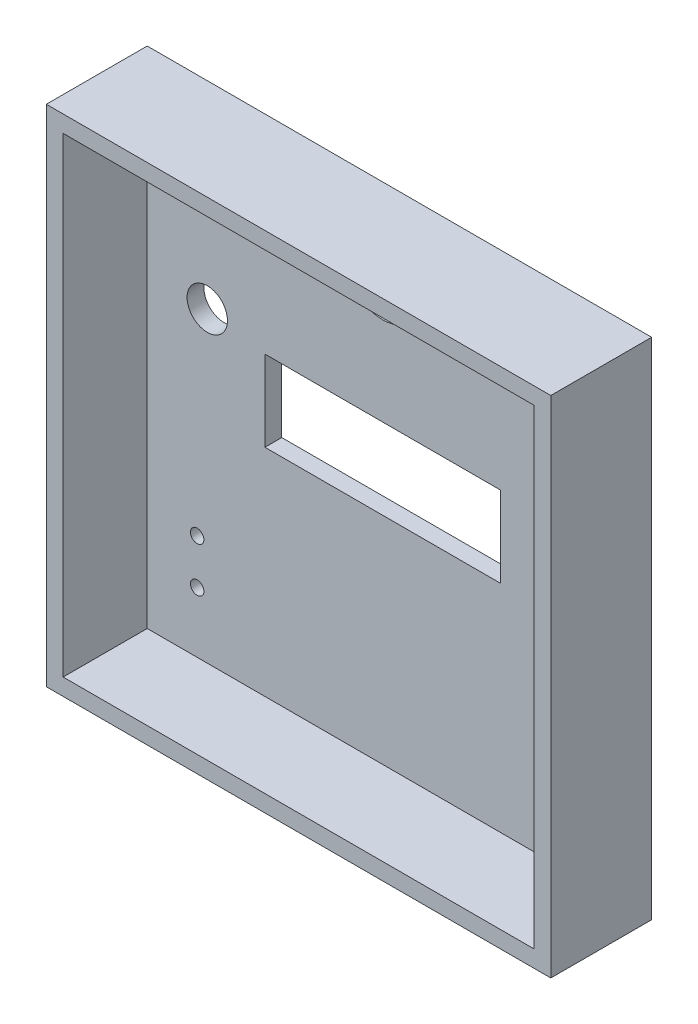
ISO-10303-21;
HEADER;
FILE_DESCRIPTION(('STEP AP214'),'2;1');
FILE_NAME('part.step','',(''),(''),'','','');
FILE_SCHEMA(('AUTOMOTIVE_DESIGN { 1 0 10303 214 1 1 1 1 }'));
ENDSEC;
DATA;
#1=APPLICATION_CONTEXT('core data for automotive mechanical design processes');
#2=APPLICATION_PROTOCOL_DEFINITION('international standard','automotive_design',2000,#1);
#3=PRODUCT_CONTEXT('',#1,'mechanical');
#4=PRODUCT('Part','Part','',(#3));
#5=PRODUCT_RELATED_PRODUCT_CATEGORY('part','',(#4));
#6=PRODUCT_DEFINITION_FORMATION('','',#4);
#7=PRODUCT_DEFINITION_CONTEXT('part definition',#1,'design');
#8=PRODUCT_DEFINITION('design','',#6,#7);
#9=PRODUCT_DEFINITION_SHAPE('','',#8);
#10=(LENGTH_UNIT() NAMED_UNIT(*) SI_UNIT(.MILLI.,.METRE.));
#11=(NAMED_UNIT(*) PLANE_ANGLE_UNIT() SI_UNIT($,.RADIAN.));
#12=(NAMED_UNIT(*) SI_UNIT($,.STERADIAN.) SOLID_ANGLE_UNIT());
#13=UNCERTAINTY_MEASURE_WITH_UNIT(LENGTH_MEASURE(1.E-05),#10,'distance_accuracy_value','');
#14=(GEOMETRIC_REPRESENTATION_CONTEXT(3) GLOBAL_UNCERTAINTY_ASSIGNED_CONTEXT((#13)) GLOBAL_UNIT_ASSIGNED_CONTEXT((#10,
#11,#12)) REPRESENTATION_CONTEXT('',''));
#15=CARTESIAN_POINT('',(0.,0.,0.));
#16=DIRECTION('',(0.,0.,1.));
#17=DIRECTION('',(1.,0.,0.));
#18=AXIS2_PLACEMENT_3D('',#15,#16,#17);
#19=CARTESIAN_POINT('',(75.,75.,30.));
#20=DIRECTION('',(-1.,0.,0.));
#21=DIRECTION('',(0.,0.,1.));
#22=AXIS2_PLACEMENT_3D('',#19,#20,#21);
#23=PLANE('',#22);
#24=DIRECTION('',(0.,1.,0.));
#25=VECTOR('',#24,1.);
#26=CARTESIAN_POINT('',(75.,75.,0.));
#27=LINE('',#26,#25);
#28=CARTESIAN_POINT('',(75.,-75.,0.));
#29=VERTEX_POINT('',#28);
#30=CARTESIAN_POINT('',(75.,75.,0.));
#31=VERTEX_POINT('',#30);
#32=EDGE_CURVE('E161',#29,#31,#27,.T.);
#33=ORIENTED_EDGE('',*,*,#32,.T.);
#34=DIRECTION('',(0.,0.,-1.));
#35=VECTOR('',#34,1.);
#36=CARTESIAN_POINT('',(75.,75.,30.));
#37=LINE('',#36,#35);
#38=CARTESIAN_POINT('',(75.,75.,30.));
#39=VERTEX_POINT('',#38);
#40=EDGE_CURVE('E211',#39,#31,#37,.T.);
#41=ORIENTED_EDGE('',*,*,#40,.F.);
#42=DIRECTION('',(0.,1.,0.));
#43=VECTOR('',#42,1.);
#44=CARTESIAN_POINT('',(75.,75.,30.));
#45=LINE('',#44,#43);
#46=CARTESIAN_POINT('',(75.,-75.,30.));
#47=VERTEX_POINT('',#46);
#48=EDGE_CURVE('E185',#47,#39,#45,.T.);
#49=ORIENTED_EDGE('',*,*,#48,.F.);
#50=DIRECTION('',(0.,0.,-1.));
#51=VECTOR('',#50,1.);
#52=CARTESIAN_POINT('',(75.,-75.,30.));
#53=LINE('',#52,#51);
#54=EDGE_CURVE('E195',#47,#29,#53,.T.);
#55=ORIENTED_EDGE('',*,*,#54,.T.);
#56=EDGE_LOOP('',(#33,#41,#49,#55));
#57=FACE_BOUND('',#56,.T.);
#58=ADVANCED_FACE('F33',(#57),#23,.F.);
#59=CARTESIAN_POINT('',(-75.,75.,30.));
#60=DIRECTION('',(0.,-1.,0.));
#61=DIRECTION('',(0.,0.,-1.));
#62=AXIS2_PLACEMENT_3D('',#59,#60,#61);
#63=PLANE('',#62);
#64=DIRECTION('',(-1.,0.,0.));
#65=VECTOR('',#64,1.);
#66=CARTESIAN_POINT('',(-75.,75.,0.));
#67=LINE('',#66,#65);
#68=CARTESIAN_POINT('',(-75.,75.,0.));
#69=VERTEX_POINT('',#68);
#70=EDGE_CURVE('E198',#31,#69,#67,.T.);
#71=ORIENTED_EDGE('',*,*,#70,.T.);
#72=DIRECTION('',(0.,0.,-1.));
#73=VECTOR('',#72,1.);
#74=CARTESIAN_POINT('',(-75.,75.,30.));
#75=LINE('',#74,#73);
#76=CARTESIAN_POINT('',(-75.,75.,30.));
#77=VERTEX_POINT('',#76);
#78=EDGE_CURVE('E208',#77,#69,#75,.T.);
#79=ORIENTED_EDGE('',*,*,#78,.F.);
#80=DIRECTION('',(-1.,0.,0.));
#81=VECTOR('',#80,1.);
#82=CARTESIAN_POINT('',(-75.,75.,30.));
#83=LINE('',#82,#81);
#84=EDGE_CURVE('E188',#39,#77,#83,.T.);
#85=ORIENTED_EDGE('',*,*,#84,.F.);
#86=ORIENTED_EDGE('',*,*,#40,.T.);
#87=EDGE_LOOP('',(#71,#79,#85,#86));
#88=FACE_BOUND('',#87,.T.);
#89=ADVANCED_FACE('F268',(#88),#63,.F.);
#90=CARTESIAN_POINT('',(-75.,75.,30.));
#91=DIRECTION('',(1.,0.,0.));
#92=DIRECTION('',(0.,1.,0.));
#93=AXIS2_PLACEMENT_3D('',#90,#91,#92);
#94=PLANE('',#93);
#95=DIRECTION('',(0.,-1.,0.));
#96=VECTOR('',#95,1.);
#97=CARTESIAN_POINT('',(-75.,75.,0.));
#98=LINE('',#97,#96);
#99=CARTESIAN_POINT('',(-75.,-75.,0.));
#100=VERTEX_POINT('',#99);
#101=EDGE_CURVE('E200',#69,#100,#98,.T.);
#102=ORIENTED_EDGE('',*,*,#101,.T.);
#103=DIRECTION('',(0.,0.,-1.));
#104=VECTOR('',#103,1.);
#105=CARTESIAN_POINT('',(-75.,-75.,30.));
#106=LINE('',#105,#104);
#107=CARTESIAN_POINT('',(-75.,-75.,30.));
#108=VERTEX_POINT('',#107);
#109=EDGE_CURVE('E205',#108,#100,#106,.T.);
#110=ORIENTED_EDGE('',*,*,#109,.F.);
#111=DIRECTION('',(0.,-1.,0.));
#112=VECTOR('',#111,1.);
#113=CARTESIAN_POINT('',(-75.,75.,30.));
#114=LINE('',#113,#112);
#115=EDGE_CURVE('E191',#77,#108,#114,.T.);
#116=ORIENTED_EDGE('',*,*,#115,.F.);
#117=ORIENTED_EDGE('',*,*,#78,.T.);
#118=EDGE_LOOP('',(#102,#110,#116,#117));
#119=FACE_BOUND('',#118,.T.);
#120=ADVANCED_FACE('F273',(#119),#94,.F.);
#121=CARTESIAN_POINT('',(-75.,-75.,30.));
#122=DIRECTION('',(0.,1.,0.));
#123=DIRECTION('',(0.,0.,1.));
#124=AXIS2_PLACEMENT_3D('',#121,#122,#123);
#125=PLANE('',#124);
#126=DIRECTION('',(1.,0.,0.));
#127=VECTOR('',#126,1.);
#128=CARTESIAN_POINT('',(-75.,-75.,0.));
#129=LINE('',#128,#127);
#130=EDGE_CURVE('E189',#100,#29,#129,.T.);
#131=ORIENTED_EDGE('',*,*,#130,.T.);
#132=ORIENTED_EDGE('',*,*,#54,.F.);
#133=DIRECTION('',(1.,0.,0.));
#134=VECTOR('',#133,1.);
#135=CARTESIAN_POINT('',(-75.,-75.,30.));
#136=LINE('',#135,#134);
#137=EDGE_CURVE('E193',#108,#47,#136,.T.);
#138=ORIENTED_EDGE('',*,*,#137,.F.);
#139=ORIENTED_EDGE('',*,*,#109,.T.);
#140=EDGE_LOOP('',(#131,#132,#138,#139));
#141=FACE_BOUND('',#140,.T.);
#142=ADVANCED_FACE('F261',(#141),#125,.F.);
#143=CARTESIAN_POINT('',(75.,-75.,30.));
#144=DIRECTION('',(0.,0.,1.));
#145=DIRECTION('',(1.,0.,0.));
#146=AXIS2_PLACEMENT_3D('',#143,#144,#145);
#147=PLANE('',#146);
#148=DIRECTION('',(0.,1.,0.));
#149=VECTOR('',#148,1.);
#150=CARTESIAN_POINT('',(70.,75.,30.));
#151=LINE('',#150,#149);
#152=CARTESIAN_POINT('',(70.,-70.,30.));
#153=VERTEX_POINT('',#152);
#154=CARTESIAN_POINT('',(70.,70.,30.));
#155=VERTEX_POINT('',#154);
#156=EDGE_CURVE('E177',#153,#155,#151,.T.);
#157=ORIENTED_EDGE('',*,*,#156,.F.);
#158=DIRECTION('',(1.,0.,0.));
#159=VECTOR('',#158,1.);
#160=CARTESIAN_POINT('',(-75.,-70.,30.));
#161=LINE('',#160,#159);
#162=CARTESIAN_POINT('',(-70.,-70.,30.));
#163=VERTEX_POINT('',#162);
#164=EDGE_CURVE('E167',#163,#153,#161,.T.);
#165=ORIENTED_EDGE('',*,*,#164,.F.);
#166=DIRECTION('',(0.,-1.,0.));
#167=VECTOR('',#166,1.);
#168=CARTESIAN_POINT('',(-70.,75.,30.));
#169=LINE('',#168,#167);
#170=CARTESIAN_POINT('',(-70.,70.,30.));
#171=VERTEX_POINT('',#170);
#172=EDGE_CURVE('E181',#171,#163,#169,.T.);
#173=ORIENTED_EDGE('',*,*,#172,.F.);
#174=DIRECTION('',(-1.,0.,0.));
#175=VECTOR('',#174,1.);
#176=CARTESIAN_POINT('',(-75.,70.,30.));
#177=LINE('',#176,#175);
#178=EDGE_CURVE('E179',#155,#171,#177,.T.);
#179=ORIENTED_EDGE('',*,*,#178,.F.);
#180=EDGE_LOOP('',(#157,#165,#173,#179));
#181=FACE_BOUND('',#180,.T.);
#182=ORIENTED_EDGE('',*,*,#48,.T.);
#183=ORIENTED_EDGE('',*,*,#84,.T.);
#184=ORIENTED_EDGE('',*,*,#115,.T.);
#185=ORIENTED_EDGE('',*,*,#137,.T.);
#186=EDGE_LOOP('',(#182,#183,#184,#185));
#187=FACE_BOUND('',#186,.T.);
#188=ADVANCED_FACE('F249',(#181,#187),#147,.T.);
#189=CARTESIAN_POINT('',(75.,-75.,0.));
#190=DIRECTION('',(0.,0.,1.));
#191=DIRECTION('',(1.,0.,0.));
#192=AXIS2_PLACEMENT_3D('',#189,#190,#191);
#193=PLANE('',#192);
#194=CARTESIAN_POINT('',(-55.1472827008486,-38.7311792236434,0.));
#195=DIRECTION('',(0.,0.,-1.));
#196=DIRECTION('',(-1.,0.,0.));
#197=AXIS2_PLACEMENT_3D('',#194,#195,#196);
#198=CIRCLE('',#197,2.);
#199=CARTESIAN_POINT('',(-57.1472827008486,-38.7311792236434,0.));
#200=VERTEX_POINT('',#199);
#201=EDGE_CURVE('E239',#200,#200,#198,.T.);
#202=ORIENTED_EDGE('',*,*,#201,.F.);
#203=EDGE_LOOP('',(#202));
#204=FACE_BOUND('',#203,.T.);
#205=CARTESIAN_POINT('',(-55.1472827008486,-52.0314296765937,0.));
#206=DIRECTION('',(0.,0.,-1.));
#207=DIRECTION('',(-1.,0.,0.));
#208=AXIS2_PLACEMENT_3D('',#205,#206,#207);
#209=CIRCLE('',#208,2.);
#210=CARTESIAN_POINT('',(-57.1472827008486,-52.0314296765937,0.));
#211=VERTEX_POINT('',#210);
#212=EDGE_CURVE('E229',#211,#211,#209,.T.);
#213=ORIENTED_EDGE('',*,*,#212,.F.);
#214=EDGE_LOOP('',(#213));
#215=FACE_BOUND('',#214,.T.);
#216=CARTESIAN_POINT('',(48.9524529872266,-41.3905070812934,0.));
#217=DIRECTION('',(0.,0.,-1.));
#218=DIRECTION('',(-1.,0.,0.));
#219=AXIS2_PLACEMENT_3D('',#216,#217,#218);
#220=CIRCLE('',#219,2.5);
#221=CARTESIAN_POINT('',(46.4524529872266,-41.3905070812934,0.));
#222=VERTEX_POINT('',#221);
#223=EDGE_CURVE('E226',#222,#222,#220,.T.);
#224=ORIENTED_EDGE('',*,*,#223,.F.);
#225=EDGE_LOOP('',(#224));
#226=FACE_BOUND('',#225,.T.);
#227=CARTESIAN_POINT('',(-52.1423607750195,21.1958602825252,0.));
#228=DIRECTION('',(0.,0.,-1.));
#229=DIRECTION('',(-1.,0.,0.));
#230=AXIS2_PLACEMENT_3D('',#227,#228,#229);
#231=CIRCLE('',#230,6.);
#232=CARTESIAN_POINT('',(-58.1423607750195,21.1958602825252,0.));
#233=VERTEX_POINT('',#232);
#234=EDGE_CURVE('E223',#233,#233,#231,.T.);
#235=ORIENTED_EDGE('',*,*,#234,.F.);
#236=EDGE_LOOP('',(#235));
#237=FACE_BOUND('',#236,.T.);
#238=DIRECTION('',(1.,0.,0.));
#239=VECTOR('',#238,1.);
#240=CARTESIAN_POINT('',(35.,18.168751782236,0.));
#241=LINE('',#240,#239);
#242=CARTESIAN_POINT('',(-35.,18.168751782236,0.));
#243=VERTEX_POINT('',#242);
#244=CARTESIAN_POINT('',(35.,18.168751782236,0.));
#245=VERTEX_POINT('',#244);
#246=EDGE_CURVE('E134',#243,#245,#241,.T.);
#247=ORIENTED_EDGE('',*,*,#246,.F.);
#248=DIRECTION('',(0.,1.,0.));
#249=VECTOR('',#248,1.);
#250=CARTESIAN_POINT('',(-35.,18.168751782236,0.));
#251=LINE('',#250,#249);
#252=CARTESIAN_POINT('',(-35.,-5.83124821776399,0.));
#253=VERTEX_POINT('',#252);
#254=EDGE_CURVE('E49',#253,#243,#251,.T.);
#255=ORIENTED_EDGE('',*,*,#254,.F.);
#256=DIRECTION('',(-1.,0.,0.));
#257=VECTOR('',#256,1.);
#258=CARTESIAN_POINT('',(35.,-5.83124821776399,0.));
#259=LINE('',#258,#257);
#260=CARTESIAN_POINT('',(35.,-5.83124821776399,0.));
#261=VERTEX_POINT('',#260);
#262=EDGE_CURVE('E141',#261,#253,#259,.T.);
#263=ORIENTED_EDGE('',*,*,#262,.F.);
#264=DIRECTION('',(0.,-1.,0.));
#265=VECTOR('',#264,1.);
#266=CARTESIAN_POINT('',(35.,18.168751782236,0.));
#267=LINE('',#266,#265);
#268=EDGE_CURVE('E125',#245,#261,#267,.T.);
#269=ORIENTED_EDGE('',*,*,#268,.F.);
#270=EDGE_LOOP('',(#247,#255,#263,#269));
#271=FACE_BOUND('',#270,.T.);
#272=CARTESIAN_POINT('',(0.,55.5037568031629,0.));
#273=DIRECTION('',(0.,0.,-1.));
#274=DIRECTION('',(-1.,0.,0.));
#275=AXIS2_PLACEMENT_3D('',#272,#273,#274);
#276=CIRCLE('',#275,11.);
#277=CARTESIAN_POINT('',(-11.,55.5037568031629,0.));
#278=VERTEX_POINT('',#277);
#279=EDGE_CURVE('E148',#278,#278,#276,.T.);
#280=ORIENTED_EDGE('',*,*,#279,.F.);
#281=EDGE_LOOP('',(#280));
#282=FACE_BOUND('',#281,.T.);
#283=ORIENTED_EDGE('',*,*,#32,.F.);
#284=ORIENTED_EDGE('',*,*,#130,.F.);
#285=ORIENTED_EDGE('',*,*,#101,.F.);
#286=ORIENTED_EDGE('',*,*,#70,.F.);
#287=EDGE_LOOP('',(#283,#284,#285,#286));
#288=FACE_BOUND('',#287,.T.);
#289=ADVANCED_FACE('F138',(#204,#215,#226,#237,#271,#282,#288),#193,.F.);
#290=CARTESIAN_POINT('',(70.,75.,30.));
#291=DIRECTION('',(-1.,0.,0.));
#292=DIRECTION('',(0.,0.,1.));
#293=AXIS2_PLACEMENT_3D('',#290,#291,#292);
#294=PLANE('',#293);
#295=DIRECTION('',(0.,1.,0.));
#296=VECTOR('',#295,1.);
#297=CARTESIAN_POINT('',(70.,75.,5.));
#298=LINE('',#297,#296);
#299=CARTESIAN_POINT('',(70.,-70.,5.));
#300=VERTEX_POINT('',#299);
#301=CARTESIAN_POINT('',(70.,70.,5.));
#302=VERTEX_POINT('',#301);
#303=EDGE_CURVE('E154',#300,#302,#298,.T.);
#304=ORIENTED_EDGE('',*,*,#303,.F.);
#305=DIRECTION('',(0.,0.,-1.));
#306=VECTOR('',#305,1.);
#307=CARTESIAN_POINT('',(70.,-70.,30.));
#308=LINE('',#307,#306);
#309=EDGE_CURVE('E163',#153,#300,#308,.T.);
#310=ORIENTED_EDGE('',*,*,#309,.F.);
#311=ORIENTED_EDGE('',*,*,#156,.T.);
#312=DIRECTION('',(0.,0.,-1.));
#313=VECTOR('',#312,1.);
#314=CARTESIAN_POINT('',(70.,70.,30.));
#315=LINE('',#314,#313);
#316=EDGE_CURVE('E158',#155,#302,#315,.T.);
#317=ORIENTED_EDGE('',*,*,#316,.T.);
#318=EDGE_LOOP('',(#304,#310,#311,#317));
#319=FACE_BOUND('',#318,.T.);
#320=ADVANCED_FACE('F248',(#319),#294,.T.);
#321=CARTESIAN_POINT('',(-75.,70.,30.));
#322=DIRECTION('',(0.,-1.,0.));
#323=DIRECTION('',(0.,0.,-1.));
#324=AXIS2_PLACEMENT_3D('',#321,#322,#323);
#325=PLANE('',#324);
#326=DIRECTION('',(-1.,0.,0.));
#327=VECTOR('',#326,1.);
#328=CARTESIAN_POINT('',(-75.,70.,5.));
#329=LINE('',#328,#327);
#330=CARTESIAN_POINT('',(-70.,70.,5.));
#331=VERTEX_POINT('',#330);
#332=EDGE_CURVE('E157',#302,#331,#329,.T.);
#333=ORIENTED_EDGE('',*,*,#332,.F.);
#334=ORIENTED_EDGE('',*,*,#316,.F.);
#335=ORIENTED_EDGE('',*,*,#178,.T.);
#336=DIRECTION('',(0.,0.,-1.));
#337=VECTOR('',#336,1.);
#338=CARTESIAN_POINT('',(-70.,70.,30.));
#339=LINE('',#338,#337);
#340=EDGE_CURVE('E162',#171,#331,#339,.T.);
#341=ORIENTED_EDGE('',*,*,#340,.T.);
#342=EDGE_LOOP('',(#333,#334,#335,#341));
#343=FACE_BOUND('',#342,.T.);
#344=ADVANCED_FACE('F257',(#343),#325,.T.);
#345=CARTESIAN_POINT('',(-70.,75.,30.));
#346=DIRECTION('',(1.,0.,0.));
#347=DIRECTION('',(0.,1.,0.));
#348=AXIS2_PLACEMENT_3D('',#345,#346,#347);
#349=PLANE('',#348);
#350=DIRECTION('',(0.,-1.,0.));
#351=VECTOR('',#350,1.);
#352=CARTESIAN_POINT('',(-70.,75.,5.));
#353=LINE('',#352,#351);
#354=CARTESIAN_POINT('',(-70.,-70.,5.));
#355=VERTEX_POINT('',#354);
#356=EDGE_CURVE('E169',#331,#355,#353,.T.);
#357=ORIENTED_EDGE('',*,*,#356,.F.);
#358=ORIENTED_EDGE('',*,*,#340,.F.);
#359=ORIENTED_EDGE('',*,*,#172,.T.);
#360=DIRECTION('',(0.,0.,-1.));
#361=VECTOR('',#360,1.);
#362=CARTESIAN_POINT('',(-70.,-70.,30.));
#363=LINE('',#362,#361);
#364=EDGE_CURVE('E166',#163,#355,#363,.T.);
#365=ORIENTED_EDGE('',*,*,#364,.T.);
#366=EDGE_LOOP('',(#357,#358,#359,#365));
#367=FACE_BOUND('',#366,.T.);
#368=ADVANCED_FACE('F314',(#367),#349,.T.);
#369=CARTESIAN_POINT('',(-75.,-70.,30.));
#370=DIRECTION('',(0.,1.,0.));
#371=DIRECTION('',(0.,0.,1.));
#372=AXIS2_PLACEMENT_3D('',#369,#370,#371);
#373=PLANE('',#372);
#374=DIRECTION('',(1.,0.,0.));
#375=VECTOR('',#374,1.);
#376=CARTESIAN_POINT('',(-75.,-70.,5.));
#377=LINE('',#376,#375);
#378=EDGE_CURVE('E173',#355,#300,#377,.T.);
#379=ORIENTED_EDGE('',*,*,#378,.F.);
#380=ORIENTED_EDGE('',*,*,#364,.F.);
#381=ORIENTED_EDGE('',*,*,#164,.T.);
#382=ORIENTED_EDGE('',*,*,#309,.T.);
#383=EDGE_LOOP('',(#379,#380,#381,#382));
#384=FACE_BOUND('',#383,.T.);
#385=ADVANCED_FACE('F322',(#384),#373,.T.);
#386=CARTESIAN_POINT('',(75.,-75.,5.));
#387=DIRECTION('',(0.,0.,1.));
#388=DIRECTION('',(1.,0.,0.));
#389=AXIS2_PLACEMENT_3D('',#386,#387,#388);
#390=PLANE('',#389);
#391=CARTESIAN_POINT('',(-55.1472827008486,-38.7311792236434,5.));
#392=DIRECTION('',(0.,0.,1.));
#393=DIRECTION('',(1.,0.,0.));
#394=AXIS2_PLACEMENT_3D('',#391,#392,#393);
#395=CIRCLE('',#394,2.);
#396=CARTESIAN_POINT('',(-53.1472827008486,-38.7311792236434,5.));
#397=VERTEX_POINT('',#396);
#398=EDGE_CURVE('E36',#397,#397,#395,.T.);
#399=ORIENTED_EDGE('',*,*,#398,.F.);
#400=EDGE_LOOP('',(#399));
#401=FACE_BOUND('',#400,.T.);
#402=CARTESIAN_POINT('',(-55.1472827008486,-52.0314296765937,5.));
#403=DIRECTION('',(0.,0.,1.));
#404=DIRECTION('',(1.,0.,0.));
#405=AXIS2_PLACEMENT_3D('',#402,#403,#404);
#406=CIRCLE('',#405,2.);
#407=CARTESIAN_POINT('',(-53.1472827008486,-52.0314296765937,5.));
#408=VERTEX_POINT('',#407);
#409=EDGE_CURVE('E227',#408,#408,#406,.T.);
#410=ORIENTED_EDGE('',*,*,#409,.F.);
#411=EDGE_LOOP('',(#410));
#412=FACE_BOUND('',#411,.T.);
#413=CARTESIAN_POINT('',(48.9524529872266,-41.3905070812934,5.));
#414=DIRECTION('',(0.,0.,1.));
#415=DIRECTION('',(1.,0.,0.));
#416=AXIS2_PLACEMENT_3D('',#413,#414,#415);
#417=CIRCLE('',#416,2.5);
#418=CARTESIAN_POINT('',(51.4524529872266,-41.3905070812934,5.));
#419=VERTEX_POINT('',#418);
#420=EDGE_CURVE('E224',#419,#419,#417,.T.);
#421=ORIENTED_EDGE('',*,*,#420,.F.);
#422=EDGE_LOOP('',(#421));
#423=FACE_BOUND('',#422,.T.);
#424=CARTESIAN_POINT('',(-52.1423607750195,21.1958602825252,5.));
#425=DIRECTION('',(0.,0.,1.));
#426=DIRECTION('',(1.,0.,0.));
#427=AXIS2_PLACEMENT_3D('',#424,#425,#426);
#428=CIRCLE('',#427,6.);
#429=CARTESIAN_POINT('',(-46.1423607750195,21.1958602825252,5.));
#430=VERTEX_POINT('',#429);
#431=EDGE_CURVE('E220',#430,#430,#428,.T.);
#432=ORIENTED_EDGE('',*,*,#431,.F.);
#433=EDGE_LOOP('',(#432));
#434=FACE_BOUND('',#433,.T.);
#435=DIRECTION('',(0.,-1.,0.));
#436=VECTOR('',#435,1.);
#437=CARTESIAN_POINT('',(-35.,-75.,5.));
#438=LINE('',#437,#436);
#439=CARTESIAN_POINT('',(-35.,18.168751782236,5.));
#440=VERTEX_POINT('',#439);
#441=CARTESIAN_POINT('',(-35.,-5.83124821776399,5.));
#442=VERTEX_POINT('',#441);
#443=EDGE_CURVE('E11',#440,#442,#438,.T.);
#444=ORIENTED_EDGE('',*,*,#443,.F.);
#445=DIRECTION('',(-1.,0.,0.));
#446=VECTOR('',#445,1.);
#447=CARTESIAN_POINT('',(75.,18.168751782236,5.));
#448=LINE('',#447,#446);
#449=CARTESIAN_POINT('',(35.,18.168751782236,5.));
#450=VERTEX_POINT('',#449);
#451=EDGE_CURVE('E214',#450,#440,#448,.T.);
#452=ORIENTED_EDGE('',*,*,#451,.F.);
#453=DIRECTION('',(0.,1.,0.));
#454=VECTOR('',#453,1.);
#455=CARTESIAN_POINT('',(35.,-75.,5.));
#456=LINE('',#455,#454);
#457=CARTESIAN_POINT('',(35.,-5.83124821776399,5.));
#458=VERTEX_POINT('',#457);
#459=EDGE_CURVE('E128',#458,#450,#456,.T.);
#460=ORIENTED_EDGE('',*,*,#459,.F.);
#461=DIRECTION('',(1.,0.,0.));
#462=VECTOR('',#461,1.);
#463=CARTESIAN_POINT('',(75.,-5.83124821776399,5.));
#464=LINE('',#463,#462);
#465=EDGE_CURVE('E41',#442,#458,#464,.T.);
#466=ORIENTED_EDGE('',*,*,#465,.F.);
#467=EDGE_LOOP('',(#444,#452,#460,#466));
#468=FACE_BOUND('',#467,.T.);
#469=CARTESIAN_POINT('',(0.,55.5037568031629,5.));
#470=DIRECTION('',(0.,0.,1.));
#471=DIRECTION('',(1.,0.,0.));
#472=AXIS2_PLACEMENT_3D('',#469,#470,#471);
#473=CIRCLE('',#472,11.);
#474=CARTESIAN_POINT('',(11.,55.5037568031629,5.));
#475=VERTEX_POINT('',#474);
#476=EDGE_CURVE('E153',#475,#475,#473,.T.);
#477=ORIENTED_EDGE('',*,*,#476,.F.);
#478=EDGE_LOOP('',(#477));
#479=FACE_BOUND('',#478,.T.);
#480=ORIENTED_EDGE('',*,*,#303,.T.);
#481=ORIENTED_EDGE('',*,*,#332,.T.);
#482=ORIENTED_EDGE('',*,*,#356,.T.);
#483=ORIENTED_EDGE('',*,*,#378,.T.);
#484=EDGE_LOOP('',(#480,#481,#482,#483));
#485=FACE_BOUND('',#484,.T.);
#486=ADVANCED_FACE('F330',(#401,#412,#423,#434,#468,#479,#485),#390,.T.);
#487=CARTESIAN_POINT('',(0.,55.5037568031629,10.));
#488=DIRECTION('',(0.,0.,-1.));
#489=DIRECTION('',(-1.,0.,0.));
#490=AXIS2_PLACEMENT_3D('',#487,#488,#489);
#491=CYLINDRICAL_SURFACE('',#490,11.);
#492=ORIENTED_EDGE('',*,*,#476,.T.);
#493=EDGE_LOOP('',(#492));
#494=FACE_BOUND('',#493,.T.);
#495=ORIENTED_EDGE('',*,*,#279,.T.);
#496=EDGE_LOOP('',(#495));
#497=FACE_BOUND('',#496,.T.);
#498=ADVANCED_FACE('F339',(#494,#497),#491,.F.);
#499=CARTESIAN_POINT('',(-35.,18.168751782236,10.));
#500=DIRECTION('',(-1.,0.,0.));
#501=DIRECTION('',(0.,0.,1.));
#502=AXIS2_PLACEMENT_3D('',#499,#500,#501);
#503=PLANE('',#502);
#504=ORIENTED_EDGE('',*,*,#443,.T.);
#505=DIRECTION('',(0.,0.,-1.));
#506=VECTOR('',#505,1.);
#507=CARTESIAN_POINT('',(-35.,-5.83124821776399,10.));
#508=LINE('',#507,#506);
#509=EDGE_CURVE('E146',#442,#253,#508,.T.);
#510=ORIENTED_EDGE('',*,*,#509,.T.);
#511=ORIENTED_EDGE('',*,*,#254,.T.);
#512=DIRECTION('',(0.,0.,-1.));
#513=VECTOR('',#512,1.);
#514=CARTESIAN_POINT('',(-35.,18.168751782236,10.));
#515=LINE('',#514,#513);
#516=EDGE_CURVE('E131',#440,#243,#515,.T.);
#517=ORIENTED_EDGE('',*,*,#516,.F.);
#518=EDGE_LOOP('',(#504,#510,#511,#517));
#519=FACE_BOUND('',#518,.T.);
#520=ADVANCED_FACE('F349',(#519),#503,.F.);
#521=CARTESIAN_POINT('',(35.,-5.83124821776399,10.));
#522=DIRECTION('',(0.,-1.,0.));
#523=DIRECTION('',(0.,0.,-1.));
#524=AXIS2_PLACEMENT_3D('',#521,#522,#523);
#525=PLANE('',#524);
#526=ORIENTED_EDGE('',*,*,#465,.T.);
#527=DIRECTION('',(0.,0.,-1.));
#528=VECTOR('',#527,1.);
#529=CARTESIAN_POINT('',(35.,-5.83124821776399,10.));
#530=LINE('',#529,#528);
#531=EDGE_CURVE('E130',#458,#261,#530,.T.);
#532=ORIENTED_EDGE('',*,*,#531,.T.);
#533=ORIENTED_EDGE('',*,*,#262,.T.);
#534=ORIENTED_EDGE('',*,*,#509,.F.);
#535=EDGE_LOOP('',(#526,#532,#533,#534));
#536=FACE_BOUND('',#535,.T.);
#537=ADVANCED_FACE('F356',(#536),#525,.F.);
#538=CARTESIAN_POINT('',(35.,18.168751782236,10.));
#539=DIRECTION('',(1.,0.,0.));
#540=DIRECTION('',(0.,0.,-1.));
#541=AXIS2_PLACEMENT_3D('',#538,#539,#540);
#542=PLANE('',#541);
#543=ORIENTED_EDGE('',*,*,#459,.T.);
#544=DIRECTION('',(0.,0.,-1.));
#545=VECTOR('',#544,1.);
#546=CARTESIAN_POINT('',(35.,18.168751782236,10.));
#547=LINE('',#546,#545);
#548=EDGE_CURVE('E57',#450,#245,#547,.T.);
#549=ORIENTED_EDGE('',*,*,#548,.T.);
#550=ORIENTED_EDGE('',*,*,#268,.T.);
#551=ORIENTED_EDGE('',*,*,#531,.F.);
#552=EDGE_LOOP('',(#543,#549,#550,#551));
#553=FACE_BOUND('',#552,.T.);
#554=ADVANCED_FACE('F122',(#553),#542,.F.);
#555=CARTESIAN_POINT('',(35.,18.168751782236,10.));
#556=DIRECTION('',(0.,1.,0.));
#557=DIRECTION('',(0.,0.,1.));
#558=AXIS2_PLACEMENT_3D('',#555,#556,#557);
#559=PLANE('',#558);
#560=ORIENTED_EDGE('',*,*,#451,.T.);
#561=ORIENTED_EDGE('',*,*,#516,.T.);
#562=ORIENTED_EDGE('',*,*,#246,.T.);
#563=ORIENTED_EDGE('',*,*,#548,.F.);
#564=EDGE_LOOP('',(#560,#561,#562,#563));
#565=FACE_BOUND('',#564,.T.);
#566=ADVANCED_FACE('F135',(#565),#559,.F.);
#567=CARTESIAN_POINT('',(-52.1423607750195,21.1958602825252,10.));
#568=DIRECTION('',(0.,0.,-1.));
#569=DIRECTION('',(-1.,0.,0.));
#570=AXIS2_PLACEMENT_3D('',#567,#568,#569);
#571=CYLINDRICAL_SURFACE('',#570,6.);
#572=ORIENTED_EDGE('',*,*,#431,.T.);
#573=EDGE_LOOP('',(#572));
#574=FACE_BOUND('',#573,.T.);
#575=ORIENTED_EDGE('',*,*,#234,.T.);
#576=EDGE_LOOP('',(#575));
#577=FACE_BOUND('',#576,.T.);
#578=ADVANCED_FACE('F245',(#574,#577),#571,.F.);
#579=CARTESIAN_POINT('',(48.9524529872266,-41.3905070812934,10.));
#580=DIRECTION('',(0.,0.,-1.));
#581=DIRECTION('',(-1.,0.,0.));
#582=AXIS2_PLACEMENT_3D('',#579,#580,#581);
#583=CYLINDRICAL_SURFACE('',#582,2.5);
#584=ORIENTED_EDGE('',*,*,#420,.T.);
#585=EDGE_LOOP('',(#584));
#586=FACE_BOUND('',#585,.T.);
#587=ORIENTED_EDGE('',*,*,#223,.T.);
#588=EDGE_LOOP('',(#587));
#589=FACE_BOUND('',#588,.T.);
#590=ADVANCED_FACE('F382',(#586,#589),#583,.F.);
#591=CARTESIAN_POINT('',(-55.1472827008486,-52.0314296765937,10.));
#592=DIRECTION('',(0.,0.,-1.));
#593=DIRECTION('',(-1.,0.,0.));
#594=AXIS2_PLACEMENT_3D('',#591,#592,#593);
#595=CYLINDRICAL_SURFACE('',#594,2.);
#596=ORIENTED_EDGE('',*,*,#409,.T.);
#597=EDGE_LOOP('',(#596));
#598=FACE_BOUND('',#597,.T.);
#599=ORIENTED_EDGE('',*,*,#212,.T.);
#600=EDGE_LOOP('',(#599));
#601=FACE_BOUND('',#600,.T.);
#602=ADVANCED_FACE('F389',(#598,#601),#595,.F.);
#603=CARTESIAN_POINT('',(-55.1472827008486,-38.7311792236434,10.));
#604=DIRECTION('',(0.,0.,-1.));
#605=DIRECTION('',(-1.,0.,0.));
#606=AXIS2_PLACEMENT_3D('',#603,#604,#605);
#607=CYLINDRICAL_SURFACE('',#606,2.);
#608=ORIENTED_EDGE('',*,*,#398,.T.);
#609=EDGE_LOOP('',(#608));
#610=FACE_BOUND('',#609,.T.);
#611=ORIENTED_EDGE('',*,*,#201,.T.);
#612=EDGE_LOOP('',(#611));
#613=FACE_BOUND('',#612,.T.);
#614=ADVANCED_FACE('F396',(#610,#613),#607,.F.);
#615=CLOSED_SHELL('',(#58,#89,#120,#142,#188,#289,#320,#344,#368,#385,#486,#498,#520,#537,#554,
#566,#578,#590,#602,#614));
#616=MANIFOLD_SOLID_BREP('B2',#615);
#617=ADVANCED_BREP_SHAPE_REPRESENTATION('',(#18,#616),#14);
#618=SHAPE_DEFINITION_REPRESENTATION(#9,#617);
ENDSEC;
END-ISO-10303-21;
